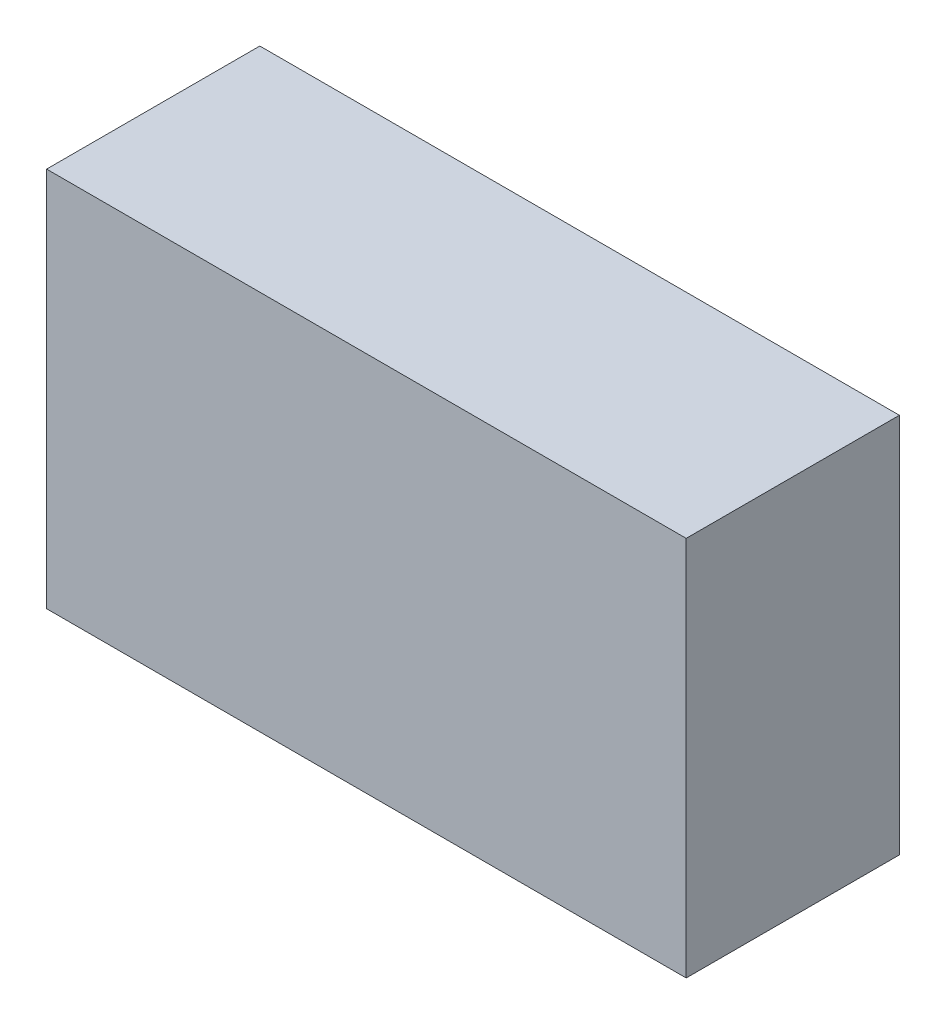
ISO-10303-21;
HEADER;
FILE_DESCRIPTION(('STEP AP214'),'2;1');
FILE_NAME('part.step','',(''),(''),'','','');
FILE_SCHEMA(('AUTOMOTIVE_DESIGN { 1 0 10303 214 1 1 1 1 }'));
ENDSEC;
DATA;
#1=APPLICATION_CONTEXT('core data for automotive mechanical design processes');
#2=APPLICATION_PROTOCOL_DEFINITION('international standard','automotive_design',2000,#1);
#3=PRODUCT_CONTEXT('',#1,'mechanical');
#4=PRODUCT('Part','Part','',(#3));
#5=PRODUCT_RELATED_PRODUCT_CATEGORY('part','',(#4));
#6=PRODUCT_DEFINITION_FORMATION('','',#4);
#7=PRODUCT_DEFINITION_CONTEXT('part definition',#1,'design');
#8=PRODUCT_DEFINITION('design','',#6,#7);
#9=PRODUCT_DEFINITION_SHAPE('','',#8);
#10=(LENGTH_UNIT() NAMED_UNIT(*) SI_UNIT(.MILLI.,.METRE.));
#11=(NAMED_UNIT(*) PLANE_ANGLE_UNIT() SI_UNIT($,.RADIAN.));
#12=(NAMED_UNIT(*) SI_UNIT($,.STERADIAN.) SOLID_ANGLE_UNIT());
#13=UNCERTAINTY_MEASURE_WITH_UNIT(LENGTH_MEASURE(1.E-05),#10,'distance_accuracy_value','');
#14=(GEOMETRIC_REPRESENTATION_CONTEXT(3) GLOBAL_UNCERTAINTY_ASSIGNED_CONTEXT((#13)) GLOBAL_UNIT_ASSIGNED_CONTEXT((#10,
#11,#12)) REPRESENTATION_CONTEXT('',''));
#15=CARTESIAN_POINT('',(0.,0.,0.));
#16=DIRECTION('',(0.,0.,1.));
#17=DIRECTION('',(1.,0.,0.));
#18=AXIS2_PLACEMENT_3D('',#15,#16,#17);
#19=CARTESIAN_POINT('',(75.,0.,0.));
#20=DIRECTION('',(0.,0.,1.));
#21=DIRECTION('',(0.,-1.,0.));
#22=AXIS2_PLACEMENT_3D('',#19,#20,#21);
#23=PLANE('',#22);
#24=DIRECTION('',(0.,1.,0.));
#25=VECTOR('',#24,1.);
#26=CARTESIAN_POINT('',(-75.,0.,0.));
#27=LINE('',#26,#25);
#28=CARTESIAN_POINT('',(-75.,-89.3,0.));
#29=VERTEX_POINT('',#28);
#30=CARTESIAN_POINT('',(-75.,0.,0.));
#31=VERTEX_POINT('',#30);
#32=EDGE_CURVE('E113',#29,#31,#27,.T.);
#33=ORIENTED_EDGE('',*,*,#32,.T.);
#34=DIRECTION('',(-1.,0.,0.));
#35=VECTOR('',#34,1.);
#36=CARTESIAN_POINT('',(75.,0.,0.));
#37=LINE('',#36,#35);
#38=CARTESIAN_POINT('',(75.,0.,0.));
#39=VERTEX_POINT('',#38);
#40=EDGE_CURVE('E11',#39,#31,#37,.T.);
#41=ORIENTED_EDGE('',*,*,#40,.F.);
#42=DIRECTION('',(0.,1.,0.));
#43=VECTOR('',#42,1.);
#44=CARTESIAN_POINT('',(75.,0.,0.));
#45=LINE('',#44,#43);
#46=CARTESIAN_POINT('',(75.,-89.3,0.));
#47=VERTEX_POINT('',#46);
#48=EDGE_CURVE('E99',#47,#39,#45,.T.);
#49=ORIENTED_EDGE('',*,*,#48,.F.);
#50=DIRECTION('',(-1.,0.,0.));
#51=VECTOR('',#50,1.);
#52=CARTESIAN_POINT('',(75.,-89.3,0.));
#53=LINE('',#52,#51);
#54=EDGE_CURVE('E109',#47,#29,#53,.T.);
#55=ORIENTED_EDGE('',*,*,#54,.T.);
#56=EDGE_LOOP('',(#33,#41,#49,#55));
#57=FACE_BOUND('',#56,.T.);
#58=ADVANCED_FACE('F42',(#57),#23,.F.);
#59=CARTESIAN_POINT('',(75.,0.,0.));
#60=DIRECTION('',(0.,-1.,0.));
#61=DIRECTION('',(0.,0.,-1.));
#62=AXIS2_PLACEMENT_3D('',#59,#60,#61);
#63=PLANE('',#62);
#64=DIRECTION('',(0.,0.,1.));
#65=VECTOR('',#64,1.);
#66=CARTESIAN_POINT('',(-75.,0.,0.));
#67=LINE('',#66,#65);
#68=CARTESIAN_POINT('',(-75.,0.,50.));
#69=VERTEX_POINT('',#68);
#70=EDGE_CURVE('E103',#31,#69,#67,.T.);
#71=ORIENTED_EDGE('',*,*,#70,.T.);
#72=DIRECTION('',(-1.,0.,0.));
#73=VECTOR('',#72,1.);
#74=CARTESIAN_POINT('',(75.,0.,50.));
#75=LINE('',#74,#73);
#76=CARTESIAN_POINT('',(75.,0.,50.));
#77=VERTEX_POINT('',#76);
#78=EDGE_CURVE('E51',#77,#69,#75,.T.);
#79=ORIENTED_EDGE('',*,*,#78,.F.);
#80=DIRECTION('',(0.,0.,1.));
#81=VECTOR('',#80,1.);
#82=CARTESIAN_POINT('',(75.,0.,0.));
#83=LINE('',#82,#81);
#84=EDGE_CURVE('E94',#39,#77,#83,.T.);
#85=ORIENTED_EDGE('',*,*,#84,.F.);
#86=ORIENTED_EDGE('',*,*,#40,.T.);
#87=EDGE_LOOP('',(#71,#79,#85,#86));
#88=FACE_BOUND('',#87,.T.);
#89=ADVANCED_FACE('F102',(#88),#63,.F.);
#90=CARTESIAN_POINT('',(75.,0.,50.));
#91=DIRECTION('',(0.,0.,-1.));
#92=DIRECTION('',(0.,1.,0.));
#93=AXIS2_PLACEMENT_3D('',#90,#91,#92);
#94=PLANE('',#93);
#95=DIRECTION('',(0.,-1.,0.));
#96=VECTOR('',#95,1.);
#97=CARTESIAN_POINT('',(-75.,0.,50.));
#98=LINE('',#97,#96);
#99=CARTESIAN_POINT('',(-75.,-89.3,50.));
#100=VERTEX_POINT('',#99);
#101=EDGE_CURVE('E80',#69,#100,#98,.T.);
#102=ORIENTED_EDGE('',*,*,#101,.T.);
#103=DIRECTION('',(-1.,0.,0.));
#104=VECTOR('',#103,1.);
#105=CARTESIAN_POINT('',(75.,-89.3,50.));
#106=LINE('',#105,#104);
#107=CARTESIAN_POINT('',(75.,-89.3,50.));
#108=VERTEX_POINT('',#107);
#109=EDGE_CURVE('E105',#108,#100,#106,.T.);
#110=ORIENTED_EDGE('',*,*,#109,.F.);
#111=DIRECTION('',(0.,-1.,0.));
#112=VECTOR('',#111,1.);
#113=CARTESIAN_POINT('',(75.,0.,50.));
#114=LINE('',#113,#112);
#115=EDGE_CURVE('E97',#77,#108,#114,.T.);
#116=ORIENTED_EDGE('',*,*,#115,.F.);
#117=ORIENTED_EDGE('',*,*,#78,.T.);
#118=EDGE_LOOP('',(#102,#110,#116,#117));
#119=FACE_BOUND('',#118,.T.);
#120=ADVANCED_FACE('F106',(#119),#94,.F.);
#121=CARTESIAN_POINT('',(75.,-89.3,0.));
#122=DIRECTION('',(0.,1.,0.));
#123=DIRECTION('',(0.,0.,1.));
#124=AXIS2_PLACEMENT_3D('',#121,#122,#123);
#125=PLANE('',#124);
#126=DIRECTION('',(0.,0.,-1.));
#127=VECTOR('',#126,1.);
#128=CARTESIAN_POINT('',(-75.,-89.3,0.));
#129=LINE('',#128,#127);
#130=EDGE_CURVE('E87',#100,#29,#129,.T.);
#131=ORIENTED_EDGE('',*,*,#130,.T.);
#132=ORIENTED_EDGE('',*,*,#54,.F.);
#133=DIRECTION('',(0.,0.,-1.));
#134=VECTOR('',#133,1.);
#135=CARTESIAN_POINT('',(75.,-89.3,0.));
#136=LINE('',#135,#134);
#137=EDGE_CURVE('E61',#108,#47,#136,.T.);
#138=ORIENTED_EDGE('',*,*,#137,.F.);
#139=ORIENTED_EDGE('',*,*,#109,.T.);
#140=EDGE_LOOP('',(#131,#132,#138,#139));
#141=FACE_BOUND('',#140,.T.);
#142=ADVANCED_FACE('F126',(#141),#125,.F.);
#143=CARTESIAN_POINT('',(75.,0.,0.));
#144=DIRECTION('',(-1.,0.,0.));
#145=DIRECTION('',(0.,0.,1.));
#146=AXIS2_PLACEMENT_3D('',#143,#144,#145);
#147=PLANE('',#146);
#148=ORIENTED_EDGE('',*,*,#48,.T.);
#149=ORIENTED_EDGE('',*,*,#84,.T.);
#150=ORIENTED_EDGE('',*,*,#115,.T.);
#151=ORIENTED_EDGE('',*,*,#137,.T.);
#152=EDGE_LOOP('',(#148,#149,#150,#151));
#153=FACE_BOUND('',#152,.T.);
#154=ADVANCED_FACE('F95',(#153),#147,.F.);
#155=CARTESIAN_POINT('',(-75.,0.,0.));
#156=DIRECTION('',(-1.,0.,0.));
#157=DIRECTION('',(0.,0.,1.));
#158=AXIS2_PLACEMENT_3D('',#155,#156,#157);
#159=PLANE('',#158);
#160=ORIENTED_EDGE('',*,*,#32,.F.);
#161=ORIENTED_EDGE('',*,*,#130,.F.);
#162=ORIENTED_EDGE('',*,*,#101,.F.);
#163=ORIENTED_EDGE('',*,*,#70,.F.);
#164=EDGE_LOOP('',(#160,#161,#162,#163));
#165=FACE_BOUND('',#164,.T.);
#166=ADVANCED_FACE('F129',(#165),#159,.T.);
#167=CLOSED_SHELL('',(#58,#89,#120,#142,#154,#166));
#168=MANIFOLD_SOLID_BREP('B2',#167);
#169=ADVANCED_BREP_SHAPE_REPRESENTATION('',(#18,#168),#14);
#170=SHAPE_DEFINITION_REPRESENTATION(#9,#169);
ENDSEC;
END-ISO-10303-21;
